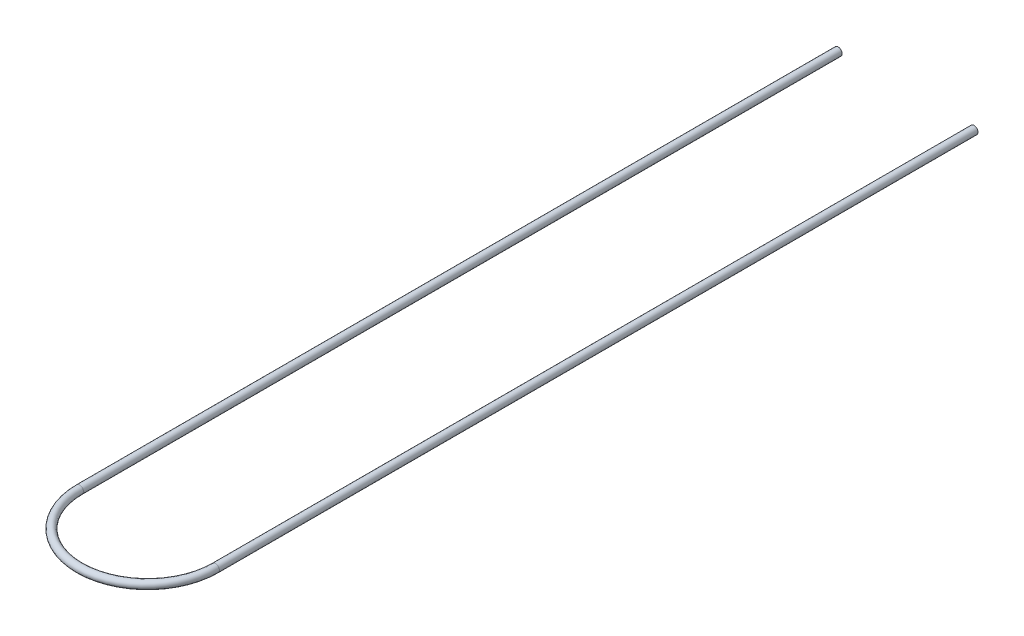
ISO-10303-21;
HEADER;
FILE_DESCRIPTION(('STEP AP214'),'2;1');
FILE_NAME('part.step','',(''),(''),'','','');
FILE_SCHEMA(('AUTOMOTIVE_DESIGN { 1 0 10303 214 1 1 1 1 }'));
ENDSEC;
DATA;
#1=APPLICATION_CONTEXT('core data for automotive mechanical design processes');
#2=APPLICATION_PROTOCOL_DEFINITION('international standard','automotive_design',2000,#1);
#3=PRODUCT_CONTEXT('',#1,'mechanical');
#4=PRODUCT('Part','Part','',(#3));
#5=PRODUCT_RELATED_PRODUCT_CATEGORY('part','',(#4));
#6=PRODUCT_DEFINITION_FORMATION('','',#4);
#7=PRODUCT_DEFINITION_CONTEXT('part definition',#1,'design');
#8=PRODUCT_DEFINITION('design','',#6,#7);
#9=PRODUCT_DEFINITION_SHAPE('','',#8);
#10=(LENGTH_UNIT() NAMED_UNIT(*) SI_UNIT(.MILLI.,.METRE.));
#11=(NAMED_UNIT(*) PLANE_ANGLE_UNIT() SI_UNIT($,.RADIAN.));
#12=(NAMED_UNIT(*) SI_UNIT($,.STERADIAN.) SOLID_ANGLE_UNIT());
#13=UNCERTAINTY_MEASURE_WITH_UNIT(LENGTH_MEASURE(1.E-05),#10,'distance_accuracy_value','');
#14=(GEOMETRIC_REPRESENTATION_CONTEXT(3) GLOBAL_UNCERTAINTY_ASSIGNED_CONTEXT((#13)) GLOBAL_UNIT_ASSIGNED_CONTEXT((#10,
#11,#12)) REPRESENTATION_CONTEXT('',''));
#15=CARTESIAN_POINT('',(0.,0.,0.));
#16=DIRECTION('',(0.,0.,1.));
#17=DIRECTION('',(1.,0.,0.));
#18=AXIS2_PLACEMENT_3D('',#15,#16,#17);
#19=CARTESIAN_POINT('',(-40.,0.,299.999999999999));
#20=DIRECTION('',(0.,0.,1.));
#21=DIRECTION('',(1.,0.,0.));
#22=AXIS2_PLACEMENT_3D('',#19,#20,#21);
#23=CYLINDRICAL_SURFACE('',#22,11.1);
#24=CARTESIAN_POINT('',(-39.9999999999997,0.,2440.));
#25=DIRECTION('',(0.,0.,1.));
#26=DIRECTION('',(1.,0.,0.));
#27=AXIS2_PLACEMENT_3D('',#24,#25,#26);
#28=CIRCLE('',#27,11.1);
#29=CARTESIAN_POINT('',(-51.0999999999997,0.,2440.));
#30=VERTEX_POINT('',#29);
#31=EDGE_CURVE('E52',#30,#30,#28,.T.);
#32=ORIENTED_EDGE('',*,*,#31,.F.);
#33=EDGE_LOOP('',(#32));
#34=FACE_BOUND('',#33,.T.);
#35=CARTESIAN_POINT('',(-40.,0.,299.999999999999));
#36=DIRECTION('',(0.,0.,1.));
#37=DIRECTION('',(1.,0.,0.));
#38=AXIS2_PLACEMENT_3D('',#35,#36,#37);
#39=CIRCLE('',#38,11.1);
#40=CARTESIAN_POINT('',(-28.9,0.,299.999999999999));
#41=VERTEX_POINT('',#40);
#42=EDGE_CURVE('E50',#41,#41,#39,.T.);
#43=ORIENTED_EDGE('',*,*,#42,.T.);
#44=EDGE_LOOP('',(#43));
#45=FACE_BOUND('',#44,.T.);
#46=ADVANCED_FACE('F29',(#34,#45),#23,.T.);
#47=CARTESIAN_POINT('',(151.695,0.,2440.));
#48=DIRECTION('',(0.,1.,0.));
#49=DIRECTION('',(0.,0.,1.));
#50=AXIS2_PLACEMENT_3D('',#47,#48,#49);
#51=TOROIDAL_SURFACE('',#50,191.695,11.1);
#52=CARTESIAN_POINT('',(343.39,0.,2440.));
#53=DIRECTION('',(0.,0.,-1.));
#54=DIRECTION('',(-1.,0.,0.));
#55=AXIS2_PLACEMENT_3D('',#52,#53,#54);
#56=CIRCLE('',#55,11.1);
#57=CARTESIAN_POINT('',(354.49,0.,2440.));
#58=VERTEX_POINT('',#57);
#59=EDGE_CURVE('E33',#58,#58,#56,.T.);
#60=CARTESIAN_POINT('',(151.695,0.,2440.));
#61=DIRECTION('',(0.,1.,0.));
#62=DIRECTION('',(0.,0.,1.));
#63=AXIS2_PLACEMENT_3D('',#60,#61,#62);
#64=CIRCLE('',#63,202.795);
#65=EDGE_CURVE('',#30,#58,#64,.T.);
#66=ORIENTED_EDGE('',*,*,#31,.T.);
#67=ORIENTED_EDGE('',*,*,#59,.F.);
#68=ORIENTED_EDGE('',*,*,#65,.T.);
#69=ORIENTED_EDGE('',*,*,#65,.F.);
#70=EDGE_LOOP('',(#66,#68,#67,#69));
#71=FACE_BOUND('',#70,.T.);
#72=ADVANCED_FACE('F60',(#71),#51,.T.);
#73=CARTESIAN_POINT('',(343.39,0.,2440.));
#74=DIRECTION('',(0.,0.,-1.));
#75=DIRECTION('',(-1.,0.,0.));
#76=AXIS2_PLACEMENT_3D('',#73,#74,#75);
#77=CYLINDRICAL_SURFACE('',#76,11.1);
#78=CARTESIAN_POINT('',(343.39,0.,299.999999999999));
#79=DIRECTION('',(0.,0.,-1.));
#80=DIRECTION('',(-1.,0.,0.));
#81=AXIS2_PLACEMENT_3D('',#78,#79,#80);
#82=CIRCLE('',#81,11.1);
#83=CARTESIAN_POINT('',(332.29,0.,299.999999999999));
#84=VERTEX_POINT('',#83);
#85=EDGE_CURVE('E46',#84,#84,#82,.T.);
#86=ORIENTED_EDGE('',*,*,#85,.F.);
#87=EDGE_LOOP('',(#86));
#88=FACE_BOUND('',#87,.T.);
#89=ORIENTED_EDGE('',*,*,#59,.T.);
#90=EDGE_LOOP('',(#89));
#91=FACE_BOUND('',#90,.T.);
#92=ADVANCED_FACE('F31',(#88,#91),#77,.T.);
#93=CARTESIAN_POINT('',(-40.,0.,299.999999999999));
#94=DIRECTION('',(0.,0.,1.));
#95=DIRECTION('',(1.,0.,0.));
#96=AXIS2_PLACEMENT_3D('',#93,#94,#95);
#97=PLANE('',#96);
#98=CARTESIAN_POINT('',(-40.,0.,299.999999999999));
#99=DIRECTION('',(0.,0.,1.));
#100=DIRECTION('',(1.,0.,0.));
#101=AXIS2_PLACEMENT_3D('',#98,#99,#100);
#102=CIRCLE('',#101,9.95000000000001);
#103=CARTESIAN_POINT('',(-30.05,0.,299.999999999999));
#104=VERTEX_POINT('',#103);
#105=EDGE_CURVE('E49',#104,#104,#102,.F.);
#106=ORIENTED_EDGE('',*,*,#105,.F.);
#107=EDGE_LOOP('',(#106));
#108=FACE_BOUND('',#107,.T.);
#109=ORIENTED_EDGE('',*,*,#42,.F.);
#110=EDGE_LOOP('',(#109));
#111=FACE_BOUND('',#110,.T.);
#112=ADVANCED_FACE('F66',(#108,#111),#97,.F.);
#113=CARTESIAN_POINT('',(343.39,0.,299.999999999999));
#114=DIRECTION('',(0.,0.,-1.));
#115=DIRECTION('',(-1.,0.,0.));
#116=AXIS2_PLACEMENT_3D('',#113,#114,#115);
#117=PLANE('',#116);
#118=CARTESIAN_POINT('',(343.39,0.,299.999999999999));
#119=DIRECTION('',(0.,0.,-1.));
#120=DIRECTION('',(-1.,0.,0.));
#121=AXIS2_PLACEMENT_3D('',#118,#119,#120);
#122=CIRCLE('',#121,9.95000000000001);
#123=CARTESIAN_POINT('',(333.44,0.,299.999999999999));
#124=VERTEX_POINT('',#123);
#125=EDGE_CURVE('E10',#124,#124,#122,.F.);
#126=ORIENTED_EDGE('',*,*,#125,.T.);
#127=EDGE_LOOP('',(#126));
#128=FACE_BOUND('',#127,.T.);
#129=ORIENTED_EDGE('',*,*,#85,.T.);
#130=EDGE_LOOP('',(#129));
#131=FACE_BOUND('',#130,.T.);
#132=ADVANCED_FACE('F84',(#128,#131),#117,.T.);
#133=CARTESIAN_POINT('',(-40.,0.,299.999999999999));
#134=DIRECTION('',(0.,0.,1.));
#135=DIRECTION('',(1.,0.,0.));
#136=AXIS2_PLACEMENT_3D('',#133,#134,#135);
#137=CYLINDRICAL_SURFACE('',#136,9.95000000000001);
#138=CARTESIAN_POINT('',(-39.9999999999997,0.,2440.));
#139=DIRECTION('',(0.,0.,1.));
#140=DIRECTION('',(1.,0.,0.));
#141=AXIS2_PLACEMENT_3D('',#138,#139,#140);
#142=CIRCLE('',#141,9.95000000000001);
#143=CARTESIAN_POINT('',(-49.9499999999997,0.,2440.));
#144=VERTEX_POINT('',#143);
#145=EDGE_CURVE('E42',#144,#144,#142,.F.);
#146=ORIENTED_EDGE('',*,*,#145,.F.);
#147=EDGE_LOOP('',(#146));
#148=FACE_BOUND('',#147,.T.);
#149=ORIENTED_EDGE('',*,*,#105,.T.);
#150=EDGE_LOOP('',(#149));
#151=FACE_BOUND('',#150,.T.);
#152=ADVANCED_FACE('F78',(#148,#151),#137,.F.);
#153=CARTESIAN_POINT('',(151.695,0.,2440.));
#154=DIRECTION('',(0.,1.,0.));
#155=DIRECTION('',(0.,0.,1.));
#156=AXIS2_PLACEMENT_3D('',#153,#154,#155);
#157=TOROIDAL_SURFACE('',#156,191.695,9.95000000000001);
#158=CARTESIAN_POINT('',(343.39,0.,2440.));
#159=DIRECTION('',(0.,0.,-1.));
#160=DIRECTION('',(-1.,0.,0.));
#161=AXIS2_PLACEMENT_3D('',#158,#159,#160);
#162=CIRCLE('',#161,9.95000000000001);
#163=CARTESIAN_POINT('',(353.34,0.,2440.));
#164=VERTEX_POINT('',#163);
#165=EDGE_CURVE('E37',#164,#164,#162,.F.);
#166=CARTESIAN_POINT('',(151.695,0.,2440.));
#167=DIRECTION('',(0.,1.,0.));
#168=DIRECTION('',(0.,0.,1.));
#169=AXIS2_PLACEMENT_3D('',#166,#167,#168);
#170=CIRCLE('',#169,201.645);
#171=EDGE_CURVE('',#144,#164,#170,.T.);
#172=ORIENTED_EDGE('',*,*,#145,.T.);
#173=ORIENTED_EDGE('',*,*,#165,.F.);
#174=ORIENTED_EDGE('',*,*,#171,.T.);
#175=ORIENTED_EDGE('',*,*,#171,.F.);
#176=EDGE_LOOP('',(#172,#174,#173,#175));
#177=FACE_BOUND('',#176,.T.);
#178=ADVANCED_FACE('F72',(#177),#157,.F.);
#179=CARTESIAN_POINT('',(343.39,0.,2440.));
#180=DIRECTION('',(0.,0.,-1.));
#181=DIRECTION('',(-1.,0.,0.));
#182=AXIS2_PLACEMENT_3D('',#179,#180,#181);
#183=CYLINDRICAL_SURFACE('',#182,9.95000000000001);
#184=ORIENTED_EDGE('',*,*,#125,.F.);
#185=EDGE_LOOP('',(#184));
#186=FACE_BOUND('',#185,.T.);
#187=ORIENTED_EDGE('',*,*,#165,.T.);
#188=EDGE_LOOP('',(#187));
#189=FACE_BOUND('',#188,.T.);
#190=ADVANCED_FACE('F70',(#186,#189),#183,.F.);
#191=CLOSED_SHELL('',(#46,#72,#92,#112,#132,#152,#178,#190));
#192=MANIFOLD_SOLID_BREP('B2',#191);
#193=ADVANCED_BREP_SHAPE_REPRESENTATION('',(#18,#192),#14);
#194=SHAPE_DEFINITION_REPRESENTATION(#9,#193);
ENDSEC;
END-ISO-10303-21;
